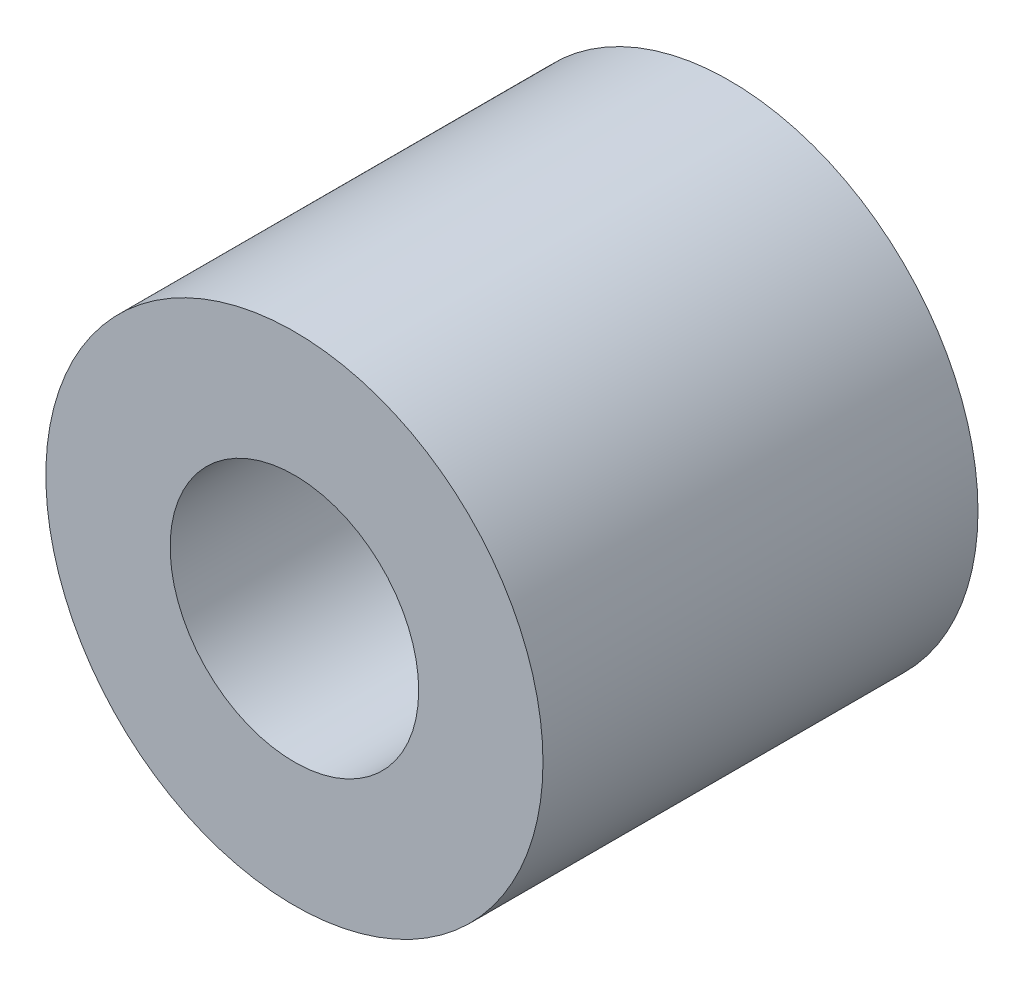
ISO-10303-21;
HEADER;
FILE_DESCRIPTION(('STEP AP214'),'2;1');
FILE_NAME('part.step','',(''),(''),'','','');
FILE_SCHEMA(('AUTOMOTIVE_DESIGN { 1 0 10303 214 1 1 1 1 }'));
ENDSEC;
DATA;
#1=APPLICATION_CONTEXT('core data for automotive mechanical design processes');
#2=APPLICATION_PROTOCOL_DEFINITION('international standard','automotive_design',2000,#1);
#3=PRODUCT_CONTEXT('',#1,'mechanical');
#4=PRODUCT('Part','Part','',(#3));
#5=PRODUCT_RELATED_PRODUCT_CATEGORY('part','',(#4));
#6=PRODUCT_DEFINITION_FORMATION('','',#4);
#7=PRODUCT_DEFINITION_CONTEXT('part definition',#1,'design');
#8=PRODUCT_DEFINITION('design','',#6,#7);
#9=PRODUCT_DEFINITION_SHAPE('','',#8);
#10=(LENGTH_UNIT() NAMED_UNIT(*) SI_UNIT(.MILLI.,.METRE.));
#11=(NAMED_UNIT(*) PLANE_ANGLE_UNIT() SI_UNIT($,.RADIAN.));
#12=(NAMED_UNIT(*) SI_UNIT($,.STERADIAN.) SOLID_ANGLE_UNIT());
#13=UNCERTAINTY_MEASURE_WITH_UNIT(LENGTH_MEASURE(1.E-05),#10,'distance_accuracy_value','');
#14=(GEOMETRIC_REPRESENTATION_CONTEXT(3) GLOBAL_UNCERTAINTY_ASSIGNED_CONTEXT((#13)) GLOBAL_UNIT_ASSIGNED_CONTEXT((#10,
#11,#12)) REPRESENTATION_CONTEXT('',''));
#15=CARTESIAN_POINT('',(0.,0.,0.));
#16=DIRECTION('',(0.,0.,1.));
#17=DIRECTION('',(1.,0.,0.));
#18=AXIS2_PLACEMENT_3D('',#15,#16,#17);
#19=CARTESIAN_POINT('',(0.,0.,2.));
#20=DIRECTION('',(0.,0.,-1.));
#21=DIRECTION('',(-1.,0.,0.));
#22=AXIS2_PLACEMENT_3D('',#19,#20,#21);
#23=CYLINDRICAL_SURFACE('',#22,8.);
#24=CARTESIAN_POINT('',(0.,0.,0.));
#25=DIRECTION('',(0.,0.,1.));
#26=DIRECTION('',(1.,0.,0.));
#27=AXIS2_PLACEMENT_3D('',#24,#25,#26);
#28=CIRCLE('',#27,8.);
#29=CARTESIAN_POINT('',(8.,0.,0.));
#30=VERTEX_POINT('',#29);
#31=EDGE_CURVE('E38',#30,#30,#28,.T.);
#32=ORIENTED_EDGE('',*,*,#31,.T.);
#33=EDGE_LOOP('',(#32));
#34=FACE_BOUND('',#33,.T.);
#35=CARTESIAN_POINT('',(0.,0.,14.));
#36=DIRECTION('',(0.,0.,1.));
#37=DIRECTION('',(1.,0.,0.));
#38=AXIS2_PLACEMENT_3D('',#35,#36,#37);
#39=CIRCLE('',#38,8.);
#40=CARTESIAN_POINT('',(8.,0.,14.));
#41=VERTEX_POINT('',#40);
#42=EDGE_CURVE('E42',#41,#41,#39,.T.);
#43=ORIENTED_EDGE('',*,*,#42,.F.);
#44=EDGE_LOOP('',(#43));
#45=FACE_BOUND('',#44,.T.);
#46=ADVANCED_FACE('F32',(#34,#45),#23,.T.);
#47=CARTESIAN_POINT('',(0.,0.,0.));
#48=DIRECTION('',(0.,0.,1.));
#49=DIRECTION('',(1.,0.,0.));
#50=AXIS2_PLACEMENT_3D('',#47,#48,#49);
#51=PLANE('',#50);
#52=ORIENTED_EDGE('',*,*,#31,.F.);
#53=EDGE_LOOP('',(#52));
#54=FACE_BOUND('',#53,.T.);
#55=ADVANCED_FACE('F56',(#54),#51,.F.);
#56=CARTESIAN_POINT('',(0.,0.,14.));
#57=DIRECTION('',(0.,0.,1.));
#58=DIRECTION('',(1.,0.,0.));
#59=AXIS2_PLACEMENT_3D('',#56,#57,#58);
#60=PLANE('',#59);
#61=ORIENTED_EDGE('',*,*,#42,.T.);
#62=EDGE_LOOP('',(#61));
#63=FACE_BOUND('',#62,.T.);
#64=CARTESIAN_POINT('',(0.,0.,14.));
#65=DIRECTION('',(0.,0.,1.));
#66=DIRECTION('',(1.,0.,0.));
#67=AXIS2_PLACEMENT_3D('',#64,#65,#66);
#68=CIRCLE('',#67,4.);
#69=CARTESIAN_POINT('',(4.,0.,14.));
#70=VERTEX_POINT('',#69);
#71=EDGE_CURVE('E46',#70,#70,#68,.T.);
#72=ORIENTED_EDGE('',*,*,#71,.F.);
#73=EDGE_LOOP('',(#72));
#74=FACE_BOUND('',#73,.T.);
#75=ADVANCED_FACE('F54',(#63,#74),#60,.T.);
#76=CARTESIAN_POINT('',(0.,0.,14.));
#77=DIRECTION('',(0.,0.,-1.));
#78=DIRECTION('',(-1.,0.,0.));
#79=AXIS2_PLACEMENT_3D('',#76,#77,#78);
#80=CYLINDRICAL_SURFACE('',#79,4.);
#81=ORIENTED_EDGE('',*,*,#71,.T.);
#82=EDGE_LOOP('',(#81));
#83=FACE_BOUND('',#82,.T.);
#84=CARTESIAN_POINT('',(0.,0.,2.));
#85=DIRECTION('',(0.,0.,1.));
#86=DIRECTION('',(1.,0.,0.));
#87=AXIS2_PLACEMENT_3D('',#84,#85,#86);
#88=CIRCLE('',#87,4.);
#89=CARTESIAN_POINT('',(4.,0.,2.));
#90=VERTEX_POINT('',#89);
#91=EDGE_CURVE('E10',#90,#90,#88,.F.);
#92=ORIENTED_EDGE('',*,*,#91,.T.);
#93=EDGE_LOOP('',(#92));
#94=FACE_BOUND('',#93,.T.);
#95=ADVANCED_FACE('F52',(#83,#94),#80,.F.);
#96=CARTESIAN_POINT('',(0.,0.,2.));
#97=DIRECTION('',(0.,0.,1.));
#98=DIRECTION('',(1.,0.,0.));
#99=AXIS2_PLACEMENT_3D('',#96,#97,#98);
#100=PLANE('',#99);
#101=ORIENTED_EDGE('',*,*,#91,.F.);
#102=EDGE_LOOP('',(#101));
#103=FACE_BOUND('',#102,.T.);
#104=ADVANCED_FACE('F63',(#103),#100,.T.);
#105=CLOSED_SHELL('',(#46,#55,#75,#95,#104));
#106=MANIFOLD_SOLID_BREP('B2',#105);
#107=ADVANCED_BREP_SHAPE_REPRESENTATION('',(#18,#106),#14);
#108=SHAPE_DEFINITION_REPRESENTATION(#9,#107);
ENDSEC;
END-ISO-10303-21;
